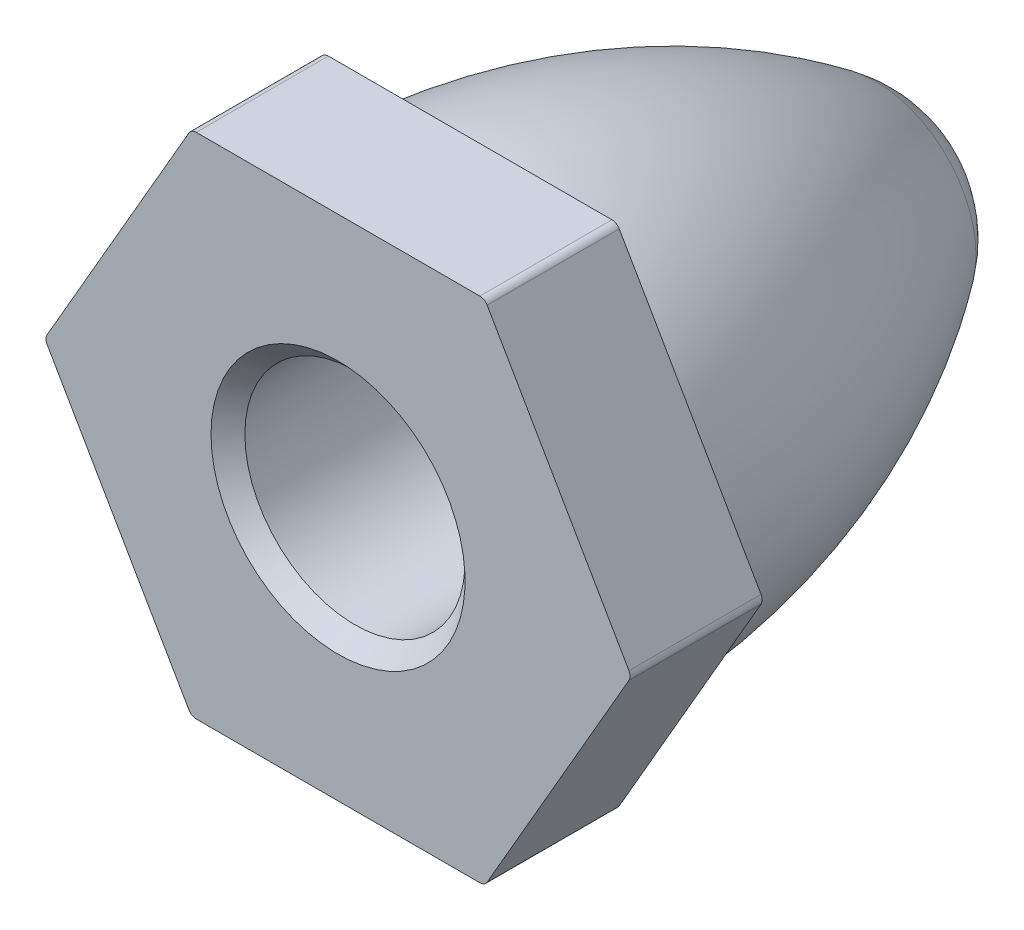
ISO-10303-21;
HEADER;
FILE_DESCRIPTION(('STEP AP214'),'2;1');
FILE_NAME('part.step','',(''),(''),'','','');
FILE_SCHEMA(('AUTOMOTIVE_DESIGN { 1 0 10303 214 1 1 1 1 }'));
ENDSEC;
DATA;
#1=APPLICATION_CONTEXT('core data for automotive mechanical design processes');
#2=APPLICATION_PROTOCOL_DEFINITION('international standard','automotive_design',2000,#1);
#3=PRODUCT_CONTEXT('',#1,'mechanical');
#4=PRODUCT('Part','Part','',(#3));
#5=PRODUCT_RELATED_PRODUCT_CATEGORY('part','',(#4));
#6=PRODUCT_DEFINITION_FORMATION('','',#4);
#7=PRODUCT_DEFINITION_CONTEXT('part definition',#1,'design');
#8=PRODUCT_DEFINITION('design','',#6,#7);
#9=PRODUCT_DEFINITION_SHAPE('','',#8);
#10=(LENGTH_UNIT() NAMED_UNIT(*) SI_UNIT(.MILLI.,.METRE.));
#11=(NAMED_UNIT(*) PLANE_ANGLE_UNIT() SI_UNIT($,.RADIAN.));
#12=(NAMED_UNIT(*) SI_UNIT($,.STERADIAN.) SOLID_ANGLE_UNIT());
#13=UNCERTAINTY_MEASURE_WITH_UNIT(LENGTH_MEASURE(1.E-05),#10,'distance_accuracy_value','');
#14=(GEOMETRIC_REPRESENTATION_CONTEXT(3) GLOBAL_UNCERTAINTY_ASSIGNED_CONTEXT((#13)) GLOBAL_UNIT_ASSIGNED_CONTEXT((#10,
#11,#12)) REPRESENTATION_CONTEXT('',''));
#15=CARTESIAN_POINT('',(0.,0.,0.));
#16=DIRECTION('',(0.,0.,1.));
#17=DIRECTION('',(1.,0.,0.));
#18=AXIS2_PLACEMENT_3D('',#15,#16,#17);
#19=CARTESIAN_POINT('',(-3.46410161513775,-5.99999999999999,3.12));
#20=DIRECTION('',(0.,0.,-1.));
#21=DIRECTION('',(-1.,0.,0.));
#22=AXIS2_PLACEMENT_3D('',#19,#20,#21);
#23=PLANE('',#22);
#24=CARTESIAN_POINT('',(0.,0.,3.12));
#25=DIRECTION('',(0.,0.,-1.));
#26=DIRECTION('',(-1.,0.,0.));
#27=AXIS2_PLACEMENT_3D('',#24,#25,#26);
#28=CIRCLE('',#27,3.00000000000002);
#29=CARTESIAN_POINT('',(-3.00000000000002,0.,3.12));
#30=VERTEX_POINT('',#29);
#31=EDGE_CURVE('E11',#30,#30,#28,.T.);
#32=ORIENTED_EDGE('',*,*,#31,.T.);
#33=EDGE_LOOP('',(#32));
#34=FACE_BOUND('',#33,.T.);
#35=DIRECTION('',(0.500000000000001,-0.866025403784438,0.));
#36=VECTOR('',#35,1.);
#37=CARTESIAN_POINT('',(-3.46410161513775,-5.99999999999999,3.12));
#38=LINE('',#37,#36);
#39=CARTESIAN_POINT('',(-6.87046820335655,-0.0999999999999994,3.12));
#40=VERTEX_POINT('',#39);
#41=CARTESIAN_POINT('',(-3.52183664205671,-5.89999999999999,3.12));
#42=VERTEX_POINT('',#41);
#43=EDGE_CURVE('E161',#40,#42,#38,.T.);
#44=ORIENTED_EDGE('',*,*,#43,.T.);
#45=CARTESIAN_POINT('',(-3.34863156129983,-5.79999999999999,3.12));
#46=DIRECTION('',(0.,0.,-1.));
#47=DIRECTION('',(-1.,0.,0.));
#48=AXIS2_PLACEMENT_3D('',#45,#46,#47);
#49=CIRCLE('',#48,0.2);
#50=CARTESIAN_POINT('',(-3.34863156129983,-5.99999999999999,3.12));
#51=VERTEX_POINT('',#50);
#52=EDGE_CURVE('E197',#42,#51,#49,.F.);
#53=ORIENTED_EDGE('',*,*,#52,.T.);
#54=DIRECTION('',(1.,0.,0.));
#55=VECTOR('',#54,1.);
#56=CARTESIAN_POINT('',(3.46410161513775,-5.99999999999999,3.12));
#57=LINE('',#56,#55);
#58=CARTESIAN_POINT('',(3.34863156129983,-5.99999999999999,3.12));
#59=VERTEX_POINT('',#58);
#60=EDGE_CURVE('E145',#51,#59,#57,.T.);
#61=ORIENTED_EDGE('',*,*,#60,.T.);
#62=CARTESIAN_POINT('',(3.34863156129983,-5.79999999999999,3.12));
#63=DIRECTION('',(0.,0.,-1.));
#64=DIRECTION('',(-1.,0.,0.));
#65=AXIS2_PLACEMENT_3D('',#62,#63,#64);
#66=CIRCLE('',#65,0.2);
#67=CARTESIAN_POINT('',(3.52183664205671,-5.89999999999999,3.12));
#68=VERTEX_POINT('',#67);
#69=EDGE_CURVE('E195',#59,#68,#66,.F.);
#70=ORIENTED_EDGE('',*,*,#69,.T.);
#71=DIRECTION('',(0.500000000000001,0.866025403784438,0.));
#72=VECTOR('',#71,1.);
#73=CARTESIAN_POINT('',(6.92820323027551,0.,3.12));
#74=LINE('',#73,#72);
#75=CARTESIAN_POINT('',(6.87046820335655,-0.0999999999999998,3.12));
#76=VERTEX_POINT('',#75);
#77=EDGE_CURVE('E296',#68,#76,#74,.T.);
#78=ORIENTED_EDGE('',*,*,#77,.T.);
#79=CARTESIAN_POINT('',(6.69726312259966,0.,3.12));
#80=DIRECTION('',(0.,0.,-1.));
#81=DIRECTION('',(-1.,0.,0.));
#82=AXIS2_PLACEMENT_3D('',#79,#80,#81);
#83=CIRCLE('',#82,0.2);
#84=CARTESIAN_POINT('',(6.87046820335655,0.0999999999999997,3.12));
#85=VERTEX_POINT('',#84);
#86=EDGE_CURVE('E191',#76,#85,#83,.F.);
#87=ORIENTED_EDGE('',*,*,#86,.T.);
#88=DIRECTION('',(-0.500000000000001,0.866025403784438,0.));
#89=VECTOR('',#88,1.);
#90=CARTESIAN_POINT('',(6.92820323027551,0.,3.12));
#91=LINE('',#90,#89);
#92=CARTESIAN_POINT('',(3.52183664205671,5.89999999999999,3.12));
#93=VERTEX_POINT('',#92);
#94=EDGE_CURVE('E291',#85,#93,#91,.T.);
#95=ORIENTED_EDGE('',*,*,#94,.T.);
#96=CARTESIAN_POINT('',(3.34863156129983,5.79999999999999,3.12));
#97=DIRECTION('',(0.,0.,-1.));
#98=DIRECTION('',(-1.,0.,0.));
#99=AXIS2_PLACEMENT_3D('',#96,#97,#98);
#100=CIRCLE('',#99,0.2);
#101=CARTESIAN_POINT('',(3.34863156129983,5.99999999999999,3.12));
#102=VERTEX_POINT('',#101);
#103=EDGE_CURVE('E189',#93,#102,#100,.F.);
#104=ORIENTED_EDGE('',*,*,#103,.T.);
#105=DIRECTION('',(-1.,0.,0.));
#106=VECTOR('',#105,1.);
#107=CARTESIAN_POINT('',(3.46410161513775,5.99999999999999,3.12));
#108=LINE('',#107,#106);
#109=CARTESIAN_POINT('',(-3.34863156129983,5.99999999999999,3.12));
#110=VERTEX_POINT('',#109);
#111=EDGE_CURVE('E289',#102,#110,#108,.T.);
#112=ORIENTED_EDGE('',*,*,#111,.T.);
#113=CARTESIAN_POINT('',(-3.34863156129983,5.79999999999999,3.12));
#114=DIRECTION('',(0.,0.,-1.));
#115=DIRECTION('',(-1.,0.,0.));
#116=AXIS2_PLACEMENT_3D('',#113,#114,#115);
#117=CIRCLE('',#116,0.2);
#118=CARTESIAN_POINT('',(-3.52183664205671,5.89999999999999,3.12));
#119=VERTEX_POINT('',#118);
#120=EDGE_CURVE('E56',#110,#119,#117,.F.);
#121=ORIENTED_EDGE('',*,*,#120,.T.);
#122=DIRECTION('',(-0.500000000000001,-0.866025403784438,0.));
#123=VECTOR('',#122,1.);
#124=CARTESIAN_POINT('',(-3.46410161513775,5.99999999999999,3.12));
#125=LINE('',#124,#123);
#126=CARTESIAN_POINT('',(-6.87046820335655,0.0999999999999994,3.12));
#127=VERTEX_POINT('',#126);
#128=EDGE_CURVE('E294',#119,#127,#125,.T.);
#129=ORIENTED_EDGE('',*,*,#128,.T.);
#130=CARTESIAN_POINT('',(-6.69726312259966,0.,3.12));
#131=DIRECTION('',(0.,0.,-1.));
#132=DIRECTION('',(-1.,0.,0.));
#133=AXIS2_PLACEMENT_3D('',#130,#131,#132);
#134=CIRCLE('',#133,0.2);
#135=EDGE_CURVE('E193',#127,#40,#134,.F.);
#136=ORIENTED_EDGE('',*,*,#135,.T.);
#137=EDGE_LOOP('',(#44,#53,#61,#70,#78,#87,#95,#104,#112,#121,#129,#136));
#138=FACE_BOUND('',#137,.T.);
#139=ADVANCED_FACE('F34',(#34,#138),#23,.F.);
#140=CARTESIAN_POINT('',(-3.46410161513775,-5.99999999999999,0.));
#141=DIRECTION('',(0.,0.,-1.));
#142=DIRECTION('',(-1.,0.,0.));
#143=AXIS2_PLACEMENT_3D('',#140,#141,#142);
#144=PLANE('',#143);
#145=CARTESIAN_POINT('',(0.,0.,0.));
#146=DIRECTION('',(0.,0.,-1.));
#147=DIRECTION('',(-1.,0.,0.));
#148=AXIS2_PLACEMENT_3D('',#145,#146,#147);
#149=CIRCLE('',#148,5.5);
#150=CARTESIAN_POINT('',(-5.5,0.,0.));
#151=VERTEX_POINT('',#150);
#152=EDGE_CURVE('E173',#151,#151,#149,.T.);
#153=ORIENTED_EDGE('',*,*,#152,.F.);
#154=EDGE_LOOP('',(#153));
#155=FACE_BOUND('',#154,.T.);
#156=DIRECTION('',(1.,0.,0.));
#157=VECTOR('',#156,1.);
#158=CARTESIAN_POINT('',(3.46410161513775,-5.99999999999999,0.));
#159=LINE('',#158,#157);
#160=CARTESIAN_POINT('',(-3.34863156129983,-5.99999999999999,0.));
#161=VERTEX_POINT('',#160);
#162=CARTESIAN_POINT('',(3.34863156129983,-5.99999999999999,0.));
#163=VERTEX_POINT('',#162);
#164=EDGE_CURVE('E142',#161,#163,#159,.T.);
#165=ORIENTED_EDGE('',*,*,#164,.F.);
#166=CARTESIAN_POINT('',(-3.34863156129983,-5.79999999999999,0.));
#167=DIRECTION('',(0.,0.,-1.));
#168=DIRECTION('',(-1.,0.,0.));
#169=AXIS2_PLACEMENT_3D('',#166,#167,#168);
#170=CIRCLE('',#169,0.2);
#171=CARTESIAN_POINT('',(-3.52183664205671,-5.89999999999999,0.));
#172=VERTEX_POINT('',#171);
#173=EDGE_CURVE('E125',#161,#172,#170,.T.);
#174=ORIENTED_EDGE('',*,*,#173,.T.);
#175=DIRECTION('',(0.500000000000001,-0.866025403784438,0.));
#176=VECTOR('',#175,1.);
#177=CARTESIAN_POINT('',(-3.46410161513775,-5.99999999999999,0.));
#178=LINE('',#177,#176);
#179=CARTESIAN_POINT('',(-6.87046820335655,-0.0999999999999994,0.));
#180=VERTEX_POINT('',#179);
#181=EDGE_CURVE('E171',#180,#172,#178,.T.);
#182=ORIENTED_EDGE('',*,*,#181,.F.);
#183=CARTESIAN_POINT('',(-6.69726312259966,0.,0.));
#184=DIRECTION('',(0.,0.,-1.));
#185=DIRECTION('',(-1.,0.,0.));
#186=AXIS2_PLACEMENT_3D('',#183,#184,#185);
#187=CIRCLE('',#186,0.2);
#188=CARTESIAN_POINT('',(-6.87046820335655,0.0999999999999994,0.));
#189=VERTEX_POINT('',#188);
#190=EDGE_CURVE('E182',#180,#189,#187,.T.);
#191=ORIENTED_EDGE('',*,*,#190,.T.);
#192=DIRECTION('',(-0.500000000000001,-0.866025403784438,0.));
#193=VECTOR('',#192,1.);
#194=CARTESIAN_POINT('',(-3.46410161513775,5.99999999999999,0.));
#195=LINE('',#194,#193);
#196=CARTESIAN_POINT('',(-3.52183664205671,5.89999999999999,0.));
#197=VERTEX_POINT('',#196);
#198=EDGE_CURVE('E169',#197,#189,#195,.T.);
#199=ORIENTED_EDGE('',*,*,#198,.F.);
#200=CARTESIAN_POINT('',(-3.34863156129983,5.79999999999999,0.));
#201=DIRECTION('',(0.,0.,-1.));
#202=DIRECTION('',(-1.,0.,0.));
#203=AXIS2_PLACEMENT_3D('',#200,#201,#202);
#204=CIRCLE('',#203,0.2);
#205=CARTESIAN_POINT('',(-3.34863156129983,5.99999999999999,0.));
#206=VERTEX_POINT('',#205);
#207=EDGE_CURVE('E146',#197,#206,#204,.T.);
#208=ORIENTED_EDGE('',*,*,#207,.T.);
#209=DIRECTION('',(-1.,0.,0.));
#210=VECTOR('',#209,1.);
#211=CARTESIAN_POINT('',(3.46410161513775,5.99999999999999,0.));
#212=LINE('',#211,#210);
#213=CARTESIAN_POINT('',(3.34863156129983,5.99999999999999,0.));
#214=VERTEX_POINT('',#213);
#215=EDGE_CURVE('E166',#214,#206,#212,.T.);
#216=ORIENTED_EDGE('',*,*,#215,.F.);
#217=CARTESIAN_POINT('',(3.34863156129983,5.79999999999999,0.));
#218=DIRECTION('',(0.,0.,-1.));
#219=DIRECTION('',(-1.,0.,0.));
#220=AXIS2_PLACEMENT_3D('',#217,#218,#219);
#221=CIRCLE('',#220,0.2);
#222=CARTESIAN_POINT('',(3.52183664205671,5.89999999999999,0.));
#223=VERTEX_POINT('',#222);
#224=EDGE_CURVE('E178',#214,#223,#221,.T.);
#225=ORIENTED_EDGE('',*,*,#224,.T.);
#226=DIRECTION('',(-0.500000000000001,0.866025403784438,0.));
#227=VECTOR('',#226,1.);
#228=CARTESIAN_POINT('',(6.92820323027551,0.,0.));
#229=LINE('',#228,#227);
#230=CARTESIAN_POINT('',(6.87046820335655,0.0999999999999997,0.));
#231=VERTEX_POINT('',#230);
#232=EDGE_CURVE('E155',#231,#223,#229,.T.);
#233=ORIENTED_EDGE('',*,*,#232,.F.);
#234=CARTESIAN_POINT('',(6.69726312259966,0.,0.));
#235=DIRECTION('',(0.,0.,-1.));
#236=DIRECTION('',(-1.,0.,0.));
#237=AXIS2_PLACEMENT_3D('',#234,#235,#236);
#238=CIRCLE('',#237,0.2);
#239=CARTESIAN_POINT('',(6.87046820335655,-0.0999999999999998,0.));
#240=VERTEX_POINT('',#239);
#241=EDGE_CURVE('E180',#231,#240,#238,.T.);
#242=ORIENTED_EDGE('',*,*,#241,.T.);
#243=DIRECTION('',(0.500000000000001,0.866025403784438,0.));
#244=VECTOR('',#243,1.);
#245=CARTESIAN_POINT('',(6.92820323027551,0.,0.));
#246=LINE('',#245,#244);
#247=CARTESIAN_POINT('',(3.52183664205671,-5.89999999999999,0.));
#248=VERTEX_POINT('',#247);
#249=EDGE_CURVE('E151',#248,#240,#246,.T.);
#250=ORIENTED_EDGE('',*,*,#249,.F.);
#251=CARTESIAN_POINT('',(3.34863156129983,-5.79999999999999,0.));
#252=DIRECTION('',(0.,0.,-1.));
#253=DIRECTION('',(-1.,0.,0.));
#254=AXIS2_PLACEMENT_3D('',#251,#252,#253);
#255=CIRCLE('',#254,0.2);
#256=EDGE_CURVE('E136',#248,#163,#255,.T.);
#257=ORIENTED_EDGE('',*,*,#256,.T.);
#258=EDGE_LOOP('',(#165,#174,#182,#191,#199,#208,#216,#225,#233,#242,#250,#257));
#259=FACE_BOUND('',#258,.T.);
#260=ADVANCED_FACE('F149',(#155,#259),#144,.T.);
#261=CARTESIAN_POINT('',(3.46410161513775,-5.99999999999999,3.12));
#262=DIRECTION('',(0.,1.,0.));
#263=DIRECTION('',(0.,0.,1.));
#264=AXIS2_PLACEMENT_3D('',#261,#262,#263);
#265=PLANE('',#264);
#266=ORIENTED_EDGE('',*,*,#60,.F.);
#267=DIRECTION('',(0.,0.,-1.));
#268=VECTOR('',#267,1.);
#269=CARTESIAN_POINT('',(-3.34863156129983,-5.99999999999999,3.12));
#270=LINE('',#269,#268);
#271=EDGE_CURVE('E129',#51,#161,#270,.T.);
#272=ORIENTED_EDGE('',*,*,#271,.T.);
#273=ORIENTED_EDGE('',*,*,#164,.T.);
#274=DIRECTION('',(0.,0.,-1.));
#275=VECTOR('',#274,1.);
#276=CARTESIAN_POINT('',(3.34863156129983,-5.99999999999999,3.12));
#277=LINE('',#276,#275);
#278=EDGE_CURVE('E147',#163,#59,#277,.F.);
#279=ORIENTED_EDGE('',*,*,#278,.T.);
#280=EDGE_LOOP('',(#266,#272,#273,#279));
#281=FACE_BOUND('',#280,.T.);
#282=ADVANCED_FACE('F141',(#281),#265,.F.);
#283=CARTESIAN_POINT('',(6.92820323027551,0.,3.12));
#284=DIRECTION('',(-0.866025403784438,0.500000000000001,0.));
#285=DIRECTION('',(-0.500000000000001,-0.866025403784438,0.));
#286=AXIS2_PLACEMENT_3D('',#283,#284,#285);
#287=PLANE('',#286);
#288=ORIENTED_EDGE('',*,*,#77,.F.);
#289=DIRECTION('',(0.,0.,-1.));
#290=VECTOR('',#289,1.);
#291=CARTESIAN_POINT('',(3.52183664205671,-5.89999999999999,3.12));
#292=LINE('',#291,#290);
#293=EDGE_CURVE('E201',#68,#248,#292,.T.);
#294=ORIENTED_EDGE('',*,*,#293,.T.);
#295=ORIENTED_EDGE('',*,*,#249,.T.);
#296=DIRECTION('',(0.,0.,-1.));
#297=VECTOR('',#296,1.);
#298=CARTESIAN_POINT('',(6.87046820335655,-0.0999999999999998,3.12));
#299=LINE('',#298,#297);
#300=EDGE_CURVE('E199',#240,#76,#299,.F.);
#301=ORIENTED_EDGE('',*,*,#300,.T.);
#302=EDGE_LOOP('',(#288,#294,#295,#301));
#303=FACE_BOUND('',#302,.T.);
#304=ADVANCED_FACE('F257',(#303),#287,.F.);
#305=CARTESIAN_POINT('',(6.92820323027551,0.,3.12));
#306=DIRECTION('',(-0.866025403784438,-0.500000000000001,0.));
#307=DIRECTION('',(0.500000000000001,-0.866025403784438,0.));
#308=AXIS2_PLACEMENT_3D('',#305,#306,#307);
#309=PLANE('',#308);
#310=ORIENTED_EDGE('',*,*,#94,.F.);
#311=DIRECTION('',(0.,0.,-1.));
#312=VECTOR('',#311,1.);
#313=CARTESIAN_POINT('',(6.87046820335655,0.0999999999999998,3.12));
#314=LINE('',#313,#312);
#315=EDGE_CURVE('E210',#85,#231,#314,.T.);
#316=ORIENTED_EDGE('',*,*,#315,.T.);
#317=ORIENTED_EDGE('',*,*,#232,.T.);
#318=DIRECTION('',(0.,0.,-1.));
#319=VECTOR('',#318,1.);
#320=CARTESIAN_POINT('',(3.52183664205671,5.89999999999999,3.12));
#321=LINE('',#320,#319);
#322=EDGE_CURVE('E208',#223,#93,#321,.F.);
#323=ORIENTED_EDGE('',*,*,#322,.T.);
#324=EDGE_LOOP('',(#310,#316,#317,#323));
#325=FACE_BOUND('',#324,.T.);
#326=ADVANCED_FACE('F253',(#325),#309,.F.);
#327=CARTESIAN_POINT('',(3.46410161513775,5.99999999999999,3.12));
#328=DIRECTION('',(0.,-1.,0.));
#329=DIRECTION('',(0.,0.,-1.));
#330=AXIS2_PLACEMENT_3D('',#327,#328,#329);
#331=PLANE('',#330);
#332=ORIENTED_EDGE('',*,*,#111,.F.);
#333=DIRECTION('',(0.,0.,-1.));
#334=VECTOR('',#333,1.);
#335=CARTESIAN_POINT('',(3.34863156129983,5.99999999999999,3.12));
#336=LINE('',#335,#334);
#337=EDGE_CURVE('E215',#102,#214,#336,.T.);
#338=ORIENTED_EDGE('',*,*,#337,.T.);
#339=ORIENTED_EDGE('',*,*,#215,.T.);
#340=DIRECTION('',(0.,0.,-1.));
#341=VECTOR('',#340,1.);
#342=CARTESIAN_POINT('',(-3.34863156129983,5.99999999999999,3.12));
#343=LINE('',#342,#341);
#344=EDGE_CURVE('E213',#206,#110,#343,.F.);
#345=ORIENTED_EDGE('',*,*,#344,.T.);
#346=EDGE_LOOP('',(#332,#338,#339,#345));
#347=FACE_BOUND('',#346,.T.);
#348=ADVANCED_FACE('F250',(#347),#331,.F.);
#349=CARTESIAN_POINT('',(-3.46410161513775,5.99999999999999,3.12));
#350=DIRECTION('',(0.866025403784438,-0.500000000000001,0.));
#351=DIRECTION('',(0.500000000000001,0.866025403784438,0.));
#352=AXIS2_PLACEMENT_3D('',#349,#350,#351);
#353=PLANE('',#352);
#354=ORIENTED_EDGE('',*,*,#198,.T.);
#355=DIRECTION('',(0.,0.,-1.));
#356=VECTOR('',#355,1.);
#357=CARTESIAN_POINT('',(-6.87046820335655,0.0999999999999994,3.12));
#358=LINE('',#357,#356);
#359=EDGE_CURVE('E49',#189,#127,#358,.F.);
#360=ORIENTED_EDGE('',*,*,#359,.T.);
#361=ORIENTED_EDGE('',*,*,#128,.F.);
#362=DIRECTION('',(0.,0.,-1.));
#363=VECTOR('',#362,1.);
#364=CARTESIAN_POINT('',(-3.52183664205671,5.89999999999999,3.12));
#365=LINE('',#364,#363);
#366=EDGE_CURVE('E204',#119,#197,#365,.T.);
#367=ORIENTED_EDGE('',*,*,#366,.T.);
#368=EDGE_LOOP('',(#354,#360,#361,#367));
#369=FACE_BOUND('',#368,.T.);
#370=ADVANCED_FACE('F246',(#369),#353,.F.);
#371=CARTESIAN_POINT('',(-3.46410161513775,-5.99999999999999,3.12));
#372=DIRECTION('',(0.866025403784438,0.500000000000001,0.));
#373=DIRECTION('',(-0.500000000000001,0.866025403784438,0.));
#374=AXIS2_PLACEMENT_3D('',#371,#372,#373);
#375=PLANE('',#374);
#376=ORIENTED_EDGE('',*,*,#181,.T.);
#377=DIRECTION('',(0.,0.,-1.));
#378=VECTOR('',#377,1.);
#379=CARTESIAN_POINT('',(-3.52183664205671,-5.89999999999999,3.12));
#380=LINE('',#379,#378);
#381=EDGE_CURVE('E130',#172,#42,#380,.F.);
#382=ORIENTED_EDGE('',*,*,#381,.T.);
#383=ORIENTED_EDGE('',*,*,#43,.F.);
#384=DIRECTION('',(0.,0.,-1.));
#385=VECTOR('',#384,1.);
#386=CARTESIAN_POINT('',(-6.87046820335655,-0.0999999999999994,3.12));
#387=LINE('',#386,#385);
#388=EDGE_CURVE('E135',#40,#180,#387,.T.);
#389=ORIENTED_EDGE('',*,*,#388,.T.);
#390=EDGE_LOOP('',(#376,#382,#383,#389));
#391=FACE_BOUND('',#390,.T.);
#392=ADVANCED_FACE('F243',(#391),#375,.F.);
#393=CARTESIAN_POINT('',(0.,0.,3.12));
#394=DIRECTION('',(0.,0.,-1.));
#395=DIRECTION('',(-1.,0.,0.));
#396=AXIS2_PLACEMENT_3D('',#393,#394,#395);
#397=CYLINDRICAL_SURFACE('',#396,2.6);
#398=CARTESIAN_POINT('',(0.,0.,2.71999999999999));
#399=DIRECTION('',(0.,0.,-1.));
#400=DIRECTION('',(-1.,0.,0.));
#401=AXIS2_PLACEMENT_3D('',#398,#399,#400);
#402=CIRCLE('',#401,2.6);
#403=CARTESIAN_POINT('',(-2.6,0.,2.71999999999999));
#404=VERTEX_POINT('',#403);
#405=EDGE_CURVE('E42',#404,#404,#402,.F.);
#406=CARTESIAN_POINT('',(0.,0.,-6.88));
#407=DIRECTION('',(0.,0.,1.));
#408=DIRECTION('',(1.,0.,0.));
#409=AXIS2_PLACEMENT_3D('',#406,#407,#408);
#410=CIRCLE('',#409,2.6);
#411=CARTESIAN_POINT('',(-2.6,0.,-6.88));
#412=VERTEX_POINT('',#411);
#413=EDGE_CURVE('E158',#412,#412,#410,.T.);
#414=CARTESIAN_POINT('',(-2.6,0.,2.71999999999999));
#415=CARTESIAN_POINT('',(-2.6,0.,2.61999999999999));
#416=CARTESIAN_POINT('',(-2.6,0.,2.51999999999999));
#417=CARTESIAN_POINT('',(-2.6,0.,2.31999999999999));
#418=CARTESIAN_POINT('',(-2.6,0.,2.21999999999999));
#419=CARTESIAN_POINT('',(-2.6,0.,2.01999999999999));
#420=CARTESIAN_POINT('',(-2.6,0.,1.91999999999999));
#421=CARTESIAN_POINT('',(-2.6,0.,1.71999999999999));
#422=CARTESIAN_POINT('',(-2.6,0.,1.61999999999999));
#423=CARTESIAN_POINT('',(-2.6,0.,1.41999999999999));
#424=CARTESIAN_POINT('',(-2.6,0.,1.31999999999999));
#425=CARTESIAN_POINT('',(-2.6,0.,1.11999999999999));
#426=CARTESIAN_POINT('',(-2.6,0.,1.01999999999999));
#427=CARTESIAN_POINT('',(-2.6,0.,0.81999999999999));
#428=CARTESIAN_POINT('',(-2.6,0.,0.719999999999989));
#429=CARTESIAN_POINT('',(-2.6,0.,0.51999999999999));
#430=CARTESIAN_POINT('',(-2.6,0.,0.41999999999999));
#431=CARTESIAN_POINT('',(-2.6,0.,0.21999999999999));
#432=CARTESIAN_POINT('',(-2.6,0.,0.11999999999999));
#433=CARTESIAN_POINT('',(-2.6,0.,-0.0800000000000095));
#434=CARTESIAN_POINT('',(-2.6,0.,-0.180000000000009));
#435=CARTESIAN_POINT('',(-2.6,0.,-0.380000000000009));
#436=CARTESIAN_POINT('',(-2.6,0.,-0.480000000000009));
#437=CARTESIAN_POINT('',(-2.6,0.,-0.680000000000009));
#438=CARTESIAN_POINT('',(-2.6,0.,-0.780000000000008));
#439=CARTESIAN_POINT('',(-2.6,0.,-0.980000000000008));
#440=CARTESIAN_POINT('',(-2.6,0.,-1.08000000000001));
#441=CARTESIAN_POINT('',(-2.6,0.,-1.28000000000001));
#442=CARTESIAN_POINT('',(-2.6,0.,-1.38000000000001));
#443=CARTESIAN_POINT('',(-2.6,0.,-1.58000000000001));
#444=CARTESIAN_POINT('',(-2.6,0.,-1.68000000000001));
#445=CARTESIAN_POINT('',(-2.6,0.,-1.88000000000001));
#446=CARTESIAN_POINT('',(-2.6,0.,-1.98000000000001));
#447=CARTESIAN_POINT('',(-2.6,0.,-2.18000000000001));
#448=CARTESIAN_POINT('',(-2.6,0.,-2.28000000000001));
#449=CARTESIAN_POINT('',(-2.6,0.,-2.48000000000001));
#450=CARTESIAN_POINT('',(-2.6,0.,-2.58000000000001));
#451=CARTESIAN_POINT('',(-2.6,0.,-2.78000000000001));
#452=CARTESIAN_POINT('',(-2.6,0.,-2.88000000000001));
#453=CARTESIAN_POINT('',(-2.6,0.,-3.08000000000001));
#454=CARTESIAN_POINT('',(-2.6,0.,-3.18000000000001));
#455=CARTESIAN_POINT('',(-2.6,0.,-3.38000000000001));
#456=CARTESIAN_POINT('',(-2.6,0.,-3.48));
#457=CARTESIAN_POINT('',(-2.6,0.,-3.68));
#458=CARTESIAN_POINT('',(-2.6,0.,-3.78));
#459=CARTESIAN_POINT('',(-2.6,0.,-3.98));
#460=CARTESIAN_POINT('',(-2.6,0.,-4.08));
#461=CARTESIAN_POINT('',(-2.6,0.,-4.28));
#462=CARTESIAN_POINT('',(-2.6,0.,-4.38));
#463=CARTESIAN_POINT('',(-2.6,0.,-4.58));
#464=CARTESIAN_POINT('',(-2.6,0.,-4.68));
#465=CARTESIAN_POINT('',(-2.6,0.,-4.88));
#466=CARTESIAN_POINT('',(-2.6,0.,-4.98));
#467=CARTESIAN_POINT('',(-2.6,0.,-5.18));
#468=CARTESIAN_POINT('',(-2.6,0.,-5.28));
#469=CARTESIAN_POINT('',(-2.6,0.,-5.48));
#470=CARTESIAN_POINT('',(-2.6,0.,-5.58));
#471=CARTESIAN_POINT('',(-2.6,0.,-5.78));
#472=CARTESIAN_POINT('',(-2.6,0.,-5.88));
#473=CARTESIAN_POINT('',(-2.6,0.,-6.08));
#474=CARTESIAN_POINT('',(-2.6,0.,-6.18));
#475=CARTESIAN_POINT('',(-2.6,0.,-6.38));
#476=CARTESIAN_POINT('',(-2.6,0.,-6.48));
#477=CARTESIAN_POINT('',(-2.6,0.,-6.68));
#478=CARTESIAN_POINT('',(-2.6,0.,-6.78));
#479=CARTESIAN_POINT('',(-2.6,0.,-6.88));
#480=B_SPLINE_CURVE_WITH_KNOTS('',3,(#414,#415,#416,#417,#418,#419,#420,#421,#422,#423,#424,
#425,#426,#427,#428,#429,#430,#431,#432,#433,#434,#435,#436,#437,#438,#439,#440,#441,#442,#443,
#444,#445,#446,#447,#448,#449,#450,#451,#452,#453,#454,#455,#456,#457,#458,#459,#460,#461,#462,
#463,#464,#465,#466,#467,#468,#469,#470,#471,#472,#473,#474,#475,#476,#477,#478,#479),
.UNSPECIFIED.,.F.,.F.,(4,2,2,2,2,2,2,2,2,2,2,2,2,2,2,2,2,2,2,2,2,2,2,2,2,2,2,2,2,2,2,2,4),(0.,
0.3,0.599999999999999,0.899999999999999,1.2,1.5,1.8,2.1,2.4,2.7,3.,3.3,3.59999999999999,
3.89999999999999,4.19999999999999,4.49999999999999,4.79999999999999,5.09999999999999,
5.39999999999999,5.69999999999999,5.99999999999999,6.29999999999999,6.59999999999999,
6.89999999999999,7.19999999999999,7.49999999999999,7.79999999999999,8.09999999999999,
8.39999999999999,8.69999999999999,8.99999999999999,9.29999999999999,9.59999999999999),.UNSPECIFIED.);
#481=EDGE_CURVE('BSEAM220',#404,#412,#480,.T.);
#482=ORIENTED_EDGE('',*,*,#405,.T.);
#483=ORIENTED_EDGE('',*,*,#413,.F.);
#484=ORIENTED_EDGE('',*,*,#481,.T.);
#485=ORIENTED_EDGE('',*,*,#481,.F.);
#486=EDGE_LOOP('',(#482,#484,#483,#485));
#487=FACE_BOUND('',#486,.T.);
#488=ADVANCED_FACE('F220',(#487),#397,.F.);
#489=CARTESIAN_POINT('',(0.,0.,-7.84642254500889));
#490=DIRECTION('',(0.,0.,1.));
#491=DIRECTION('',(1.,0.,0.));
#492=AXIS2_PLACEMENT_3D('',#489,#490,#491);
#493=SPHERICAL_SURFACE('',#492,2.93357745499111);
#494=CARTESIAN_POINT('',(0.,0.,-9.58));
#495=DIRECTION('',(0.,0.,1.));
#496=DIRECTION('',(1.,0.,0.));
#497=AXIS2_PLACEMENT_3D('',#494,#495,#496);
#498=CIRCLE('',#497,2.36655570227677);
#499=CARTESIAN_POINT('',(2.36655570227677,0.,-9.58));
#500=VERTEX_POINT('',#499);
#501=EDGE_CURVE('E152',#500,#500,#498,.T.);
#502=ORIENTED_EDGE('',*,*,#501,.F.);
#503=EDGE_LOOP('',(#502));
#504=FACE_BOUND('',#503,.T.);
#505=ADVANCED_FACE('F306',(#504),#493,.T.);
#506=CARTESIAN_POINT('',(0.,0.,0.));
#507=DIRECTION('',(0.,0.,1.));
#508=DIRECTION('',(1.,0.,0.));
#509=AXIS2_PLACEMENT_3D('',#506,#507,#508);
#510=DEGENERATE_TOROIDAL_SURFACE('',#509,10.7113737334909,16.2113737334909,.F.);
#511=ORIENTED_EDGE('',*,*,#501,.T.);
#512=EDGE_LOOP('',(#511));
#513=FACE_BOUND('',#512,.T.);
#514=ORIENTED_EDGE('',*,*,#152,.T.);
#515=EDGE_LOOP('',(#514));
#516=FACE_BOUND('',#515,.T.);
#517=ADVANCED_FACE('F310',(#513,#516),#510,.F.);
#518=CARTESIAN_POINT('',(0.,0.,-6.88));
#519=DIRECTION('',(0.,0.,1.));
#520=DIRECTION('',(1.,0.,0.));
#521=AXIS2_PLACEMENT_3D('',#518,#519,#520);
#522=PLANE('',#521);
#523=ORIENTED_EDGE('',*,*,#413,.T.);
#524=EDGE_LOOP('',(#523));
#525=FACE_BOUND('',#524,.T.);
#526=ADVANCED_FACE('F267',(#525),#522,.T.);
#527=CARTESIAN_POINT('',(-3.34863156129983,-5.79999999999999,3.12));
#528=DIRECTION('',(0.,0.,-1.));
#529=DIRECTION('',(-1.,0.,0.));
#530=AXIS2_PLACEMENT_3D('',#527,#528,#529);
#531=CYLINDRICAL_SURFACE('',#530,0.2);
#532=ORIENTED_EDGE('',*,*,#52,.F.);
#533=ORIENTED_EDGE('',*,*,#381,.F.);
#534=ORIENTED_EDGE('',*,*,#173,.F.);
#535=ORIENTED_EDGE('',*,*,#271,.F.);
#536=EDGE_LOOP('',(#532,#533,#534,#535));
#537=FACE_BOUND('',#536,.T.);
#538=ADVANCED_FACE('F128',(#537),#531,.T.);
#539=CARTESIAN_POINT('',(3.34863156129983,-5.79999999999999,3.12));
#540=DIRECTION('',(0.,0.,-1.));
#541=DIRECTION('',(-1.,0.,0.));
#542=AXIS2_PLACEMENT_3D('',#539,#540,#541);
#543=CYLINDRICAL_SURFACE('',#542,0.2);
#544=ORIENTED_EDGE('',*,*,#69,.F.);
#545=ORIENTED_EDGE('',*,*,#278,.F.);
#546=ORIENTED_EDGE('',*,*,#256,.F.);
#547=ORIENTED_EDGE('',*,*,#293,.F.);
#548=EDGE_LOOP('',(#544,#545,#546,#547));
#549=FACE_BOUND('',#548,.T.);
#550=ADVANCED_FACE('F266',(#549),#543,.T.);
#551=CARTESIAN_POINT('',(-6.69726312259966,0.,3.12));
#552=DIRECTION('',(0.,0.,-1.));
#553=DIRECTION('',(-1.,0.,0.));
#554=AXIS2_PLACEMENT_3D('',#551,#552,#553);
#555=CYLINDRICAL_SURFACE('',#554,0.2);
#556=ORIENTED_EDGE('',*,*,#135,.F.);
#557=ORIENTED_EDGE('',*,*,#359,.F.);
#558=ORIENTED_EDGE('',*,*,#190,.F.);
#559=ORIENTED_EDGE('',*,*,#388,.F.);
#560=EDGE_LOOP('',(#556,#557,#558,#559));
#561=FACE_BOUND('',#560,.T.);
#562=ADVANCED_FACE('F270',(#561),#555,.T.);
#563=CARTESIAN_POINT('',(6.69726312259966,0.,3.12));
#564=DIRECTION('',(0.,0.,-1.));
#565=DIRECTION('',(-1.,0.,0.));
#566=AXIS2_PLACEMENT_3D('',#563,#564,#565);
#567=CYLINDRICAL_SURFACE('',#566,0.2);
#568=ORIENTED_EDGE('',*,*,#86,.F.);
#569=ORIENTED_EDGE('',*,*,#300,.F.);
#570=ORIENTED_EDGE('',*,*,#241,.F.);
#571=ORIENTED_EDGE('',*,*,#315,.F.);
#572=EDGE_LOOP('',(#568,#569,#570,#571));
#573=FACE_BOUND('',#572,.T.);
#574=ADVANCED_FACE('F274',(#573),#567,.T.);
#575=CARTESIAN_POINT('',(3.34863156129983,5.79999999999999,3.12));
#576=DIRECTION('',(0.,0.,-1.));
#577=DIRECTION('',(-1.,0.,0.));
#578=AXIS2_PLACEMENT_3D('',#575,#576,#577);
#579=CYLINDRICAL_SURFACE('',#578,0.2);
#580=ORIENTED_EDGE('',*,*,#103,.F.);
#581=ORIENTED_EDGE('',*,*,#322,.F.);
#582=ORIENTED_EDGE('',*,*,#224,.F.);
#583=ORIENTED_EDGE('',*,*,#337,.F.);
#584=EDGE_LOOP('',(#580,#581,#582,#583));
#585=FACE_BOUND('',#584,.T.);
#586=ADVANCED_FACE('F229',(#585),#579,.T.);
#587=CARTESIAN_POINT('',(-3.34863156129983,5.79999999999999,3.12));
#588=DIRECTION('',(0.,0.,-1.));
#589=DIRECTION('',(-1.,0.,0.));
#590=AXIS2_PLACEMENT_3D('',#587,#588,#589);
#591=CYLINDRICAL_SURFACE('',#590,0.2);
#592=ORIENTED_EDGE('',*,*,#120,.F.);
#593=ORIENTED_EDGE('',*,*,#344,.F.);
#594=ORIENTED_EDGE('',*,*,#207,.F.);
#595=ORIENTED_EDGE('',*,*,#366,.F.);
#596=EDGE_LOOP('',(#592,#593,#594,#595));
#597=FACE_BOUND('',#596,.T.);
#598=ADVANCED_FACE('F224',(#597),#591,.T.);
#599=CARTESIAN_POINT('',(0.,0.,2.71999999999999));
#600=DIRECTION('',(0.,0.,1.));
#601=DIRECTION('',(1.,0.,0.));
#602=AXIS2_PLACEMENT_3D('',#599,#600,#601);
#603=CONICAL_SURFACE('',#602,2.6,0.785398163397451);
#604=ORIENTED_EDGE('',*,*,#31,.F.);
#605=EDGE_LOOP('',(#604));
#606=FACE_BOUND('',#605,.T.);
#607=ORIENTED_EDGE('',*,*,#405,.F.);
#608=EDGE_LOOP('',(#607));
#609=FACE_BOUND('',#608,.T.);
#610=ADVANCED_FACE('F36',(#606,#609),#603,.F.);
#611=CLOSED_SHELL('',(#139,#260,#282,#304,#326,#348,#370,#392,#488,#505,#517,#526,#538,#550,
#562,#574,#586,#598,#610));
#612=MANIFOLD_SOLID_BREP('B2',#611);
#613=ADVANCED_BREP_SHAPE_REPRESENTATION('',(#18,#612),#14);
#614=SHAPE_DEFINITION_REPRESENTATION(#9,#613);
ENDSEC;
END-ISO-10303-21;
